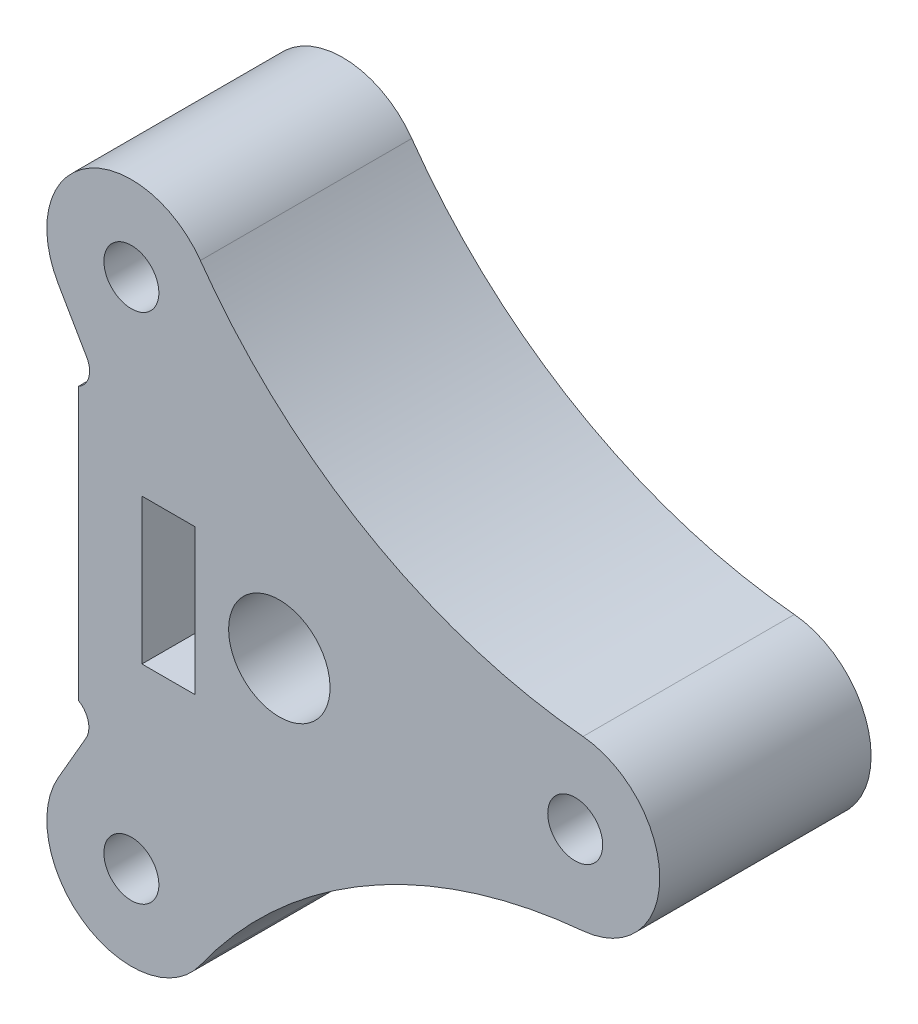
ISO-10303-21;
HEADER;
FILE_DESCRIPTION(('STEP AP214'),'2;1');
FILE_NAME('part.step','',(''),(''),'','','');
FILE_SCHEMA(('AUTOMOTIVE_DESIGN { 1 0 10303 214 1 1 1 1 }'));
ENDSEC;
DATA;
#1=APPLICATION_CONTEXT('core data for automotive mechanical design processes');
#2=APPLICATION_PROTOCOL_DEFINITION('international standard','automotive_design',2000,#1);
#3=PRODUCT_CONTEXT('',#1,'mechanical');
#4=PRODUCT('Part','Part','',(#3));
#5=PRODUCT_RELATED_PRODUCT_CATEGORY('part','',(#4));
#6=PRODUCT_DEFINITION_FORMATION('','',#4);
#7=PRODUCT_DEFINITION_CONTEXT('part definition',#1,'design');
#8=PRODUCT_DEFINITION('design','',#6,#7);
#9=PRODUCT_DEFINITION_SHAPE('','',#8);
#10=(LENGTH_UNIT() NAMED_UNIT(*) SI_UNIT(.MILLI.,.METRE.));
#11=(NAMED_UNIT(*) PLANE_ANGLE_UNIT() SI_UNIT($,.RADIAN.));
#12=(NAMED_UNIT(*) SI_UNIT($,.STERADIAN.) SOLID_ANGLE_UNIT());
#13=UNCERTAINTY_MEASURE_WITH_UNIT(LENGTH_MEASURE(1.E-05),#10,'distance_accuracy_value','');
#14=(GEOMETRIC_REPRESENTATION_CONTEXT(3) GLOBAL_UNCERTAINTY_ASSIGNED_CONTEXT((#13)) GLOBAL_UNIT_ASSIGNED_CONTEXT((#10,
#11,#12)) REPRESENTATION_CONTEXT('',''));
#15=CARTESIAN_POINT('',(0.,0.,0.));
#16=DIRECTION('',(0.,0.,1.));
#17=DIRECTION('',(1.,0.,0.));
#18=AXIS2_PLACEMENT_3D('',#15,#16,#17);
#19=CARTESIAN_POINT('',(-8.255,4.318,17.78));
#20=DIRECTION('',(1.,0.,0.));
#21=DIRECTION('',(0.,1.,0.));
#22=AXIS2_PLACEMENT_3D('',#19,#20,#21);
#23=PLANE('',#22);
#24=CARTESIAN_POINT('',(-8.255,-0.0507999999999993,8.89));
#25=DIRECTION('',(1.,0.,0.));
#26=DIRECTION('',(0.,1.,0.));
#27=AXIS2_PLACEMENT_3D('',#24,#25,#26);
#28=CIRCLE('',#27,2.159);
#29=CARTESIAN_POINT('',(-8.255,2.1082,8.89));
#30=VERTEX_POINT('',#29);
#31=EDGE_CURVE('E259',#30,#30,#28,.T.);
#32=ORIENTED_EDGE('',*,*,#31,.F.);
#33=EDGE_LOOP('',(#32));
#34=FACE_BOUND('',#33,.T.);
#35=DIRECTION('',(0.,0.,-1.));
#36=VECTOR('',#35,1.);
#37=CARTESIAN_POINT('',(-8.255,4.318,17.78));
#38=LINE('',#37,#36);
#39=CARTESIAN_POINT('',(-8.255,4.318,15.24));
#40=VERTEX_POINT('',#39);
#41=CARTESIAN_POINT('',(-8.255,4.318,3.937));
#42=VERTEX_POINT('',#41);
#43=EDGE_CURVE('E262',#40,#42,#38,.T.);
#44=ORIENTED_EDGE('',*,*,#43,.F.);
#45=DIRECTION('',(0.,-1.,0.));
#46=VECTOR('',#45,1.);
#47=CARTESIAN_POINT('',(-8.255,4.318,15.24));
#48=LINE('',#47,#46);
#49=CARTESIAN_POINT('',(-8.255,-4.4196,15.24));
#50=VERTEX_POINT('',#49);
#51=EDGE_CURVE('E55',#40,#50,#48,.T.);
#52=ORIENTED_EDGE('',*,*,#51,.T.);
#53=DIRECTION('',(0.,0.,-1.));
#54=VECTOR('',#53,1.);
#55=CARTESIAN_POINT('',(-8.255,-4.4196,17.78));
#56=LINE('',#55,#54);
#57=CARTESIAN_POINT('',(-8.255,-4.4196,3.937));
#58=VERTEX_POINT('',#57);
#59=EDGE_CURVE('E166',#50,#58,#56,.T.);
#60=ORIENTED_EDGE('',*,*,#59,.T.);
#61=DIRECTION('',(0.,-1.,0.));
#62=VECTOR('',#61,1.);
#63=CARTESIAN_POINT('',(-8.255,0.,3.937));
#64=LINE('',#63,#62);
#65=EDGE_CURVE('E265',#42,#58,#64,.T.);
#66=ORIENTED_EDGE('',*,*,#65,.F.);
#67=EDGE_LOOP('',(#44,#52,#60,#66));
#68=FACE_BOUND('',#67,.T.);
#69=ADVANCED_FACE('F40',(#34,#68),#23,.T.);
#70=CARTESIAN_POINT('',(-8.255,-4.4196,17.78));
#71=DIRECTION('',(0.,1.,0.));
#72=DIRECTION('',(0.,0.,1.));
#73=AXIS2_PLACEMENT_3D('',#70,#71,#72);
#74=PLANE('',#73);
#75=ORIENTED_EDGE('',*,*,#59,.F.);
#76=DIRECTION('',(1.,0.,0.));
#77=VECTOR('',#76,1.);
#78=CARTESIAN_POINT('',(-8.255,-4.4196,15.24));
#79=LINE('',#78,#77);
#80=CARTESIAN_POINT('',(-5.08,-4.4196,15.24));
#81=VERTEX_POINT('',#80);
#82=EDGE_CURVE('E300',#50,#81,#79,.T.);
#83=ORIENTED_EDGE('',*,*,#82,.T.);
#84=DIRECTION('',(0.,0.,-1.));
#85=VECTOR('',#84,1.);
#86=CARTESIAN_POINT('',(-5.08,-4.4196,17.78));
#87=LINE('',#86,#85);
#88=CARTESIAN_POINT('',(-5.08,-4.4196,3.937));
#89=VERTEX_POINT('',#88);
#90=EDGE_CURVE('E270',#81,#89,#87,.T.);
#91=ORIENTED_EDGE('',*,*,#90,.T.);
#92=DIRECTION('',(1.,0.,0.));
#93=VECTOR('',#92,1.);
#94=CARTESIAN_POINT('',(-17.8386121979137,-4.4196,3.937));
#95=LINE('',#94,#93);
#96=EDGE_CURVE('E272',#58,#89,#95,.T.);
#97=ORIENTED_EDGE('',*,*,#96,.F.);
#98=EDGE_LOOP('',(#75,#83,#91,#97));
#99=FACE_BOUND('',#98,.T.);
#100=ADVANCED_FACE('F248',(#99),#74,.T.);
#101=CARTESIAN_POINT('',(-5.08,4.318,17.78));
#102=DIRECTION('',(-1.,0.,0.));
#103=DIRECTION('',(0.,-1.,0.));
#104=AXIS2_PLACEMENT_3D('',#101,#102,#103);
#105=PLANE('',#104);
#106=CARTESIAN_POINT('',(-5.08,-0.050799999999999,8.89));
#107=DIRECTION('',(-1.,0.,0.));
#108=DIRECTION('',(0.,-1.,0.));
#109=AXIS2_PLACEMENT_3D('',#106,#107,#108);
#110=CIRCLE('',#109,2.159);
#111=CARTESIAN_POINT('',(-5.08,-2.2098,8.89));
#112=VERTEX_POINT('',#111);
#113=EDGE_CURVE('E189',#112,#112,#110,.T.);
#114=ORIENTED_EDGE('',*,*,#113,.F.);
#115=EDGE_LOOP('',(#114));
#116=FACE_BOUND('',#115,.T.);
#117=ORIENTED_EDGE('',*,*,#90,.F.);
#118=DIRECTION('',(0.,1.,0.));
#119=VECTOR('',#118,1.);
#120=CARTESIAN_POINT('',(-5.08,4.318,15.24));
#121=LINE('',#120,#119);
#122=CARTESIAN_POINT('',(-5.08,4.318,15.24));
#123=VERTEX_POINT('',#122);
#124=EDGE_CURVE('E302',#81,#123,#121,.T.);
#125=ORIENTED_EDGE('',*,*,#124,.T.);
#126=DIRECTION('',(0.,0.,-1.));
#127=VECTOR('',#126,1.);
#128=CARTESIAN_POINT('',(-5.08,4.318,17.78));
#129=LINE('',#128,#127);
#130=CARTESIAN_POINT('',(-5.08,4.318,3.937));
#131=VERTEX_POINT('',#130);
#132=EDGE_CURVE('E268',#123,#131,#129,.T.);
#133=ORIENTED_EDGE('',*,*,#132,.T.);
#134=DIRECTION('',(0.,1.,0.));
#135=VECTOR('',#134,1.);
#136=CARTESIAN_POINT('',(-5.08,0.,3.937));
#137=LINE('',#136,#135);
#138=EDGE_CURVE('E284',#89,#131,#137,.T.);
#139=ORIENTED_EDGE('',*,*,#138,.F.);
#140=EDGE_LOOP('',(#117,#125,#133,#139));
#141=FACE_BOUND('',#140,.T.);
#142=ADVANCED_FACE('F244',(#116,#141),#105,.T.);
#143=CARTESIAN_POINT('',(-8.255,4.318,17.78));
#144=DIRECTION('',(0.,-1.,0.));
#145=DIRECTION('',(0.,0.,-1.));
#146=AXIS2_PLACEMENT_3D('',#143,#144,#145);
#147=PLANE('',#146);
#148=ORIENTED_EDGE('',*,*,#132,.F.);
#149=DIRECTION('',(-1.,0.,0.));
#150=VECTOR('',#149,1.);
#151=CARTESIAN_POINT('',(-8.255,4.318,15.24));
#152=LINE('',#151,#150);
#153=EDGE_CURVE('E305',#123,#40,#152,.T.);
#154=ORIENTED_EDGE('',*,*,#153,.T.);
#155=ORIENTED_EDGE('',*,*,#43,.T.);
#156=DIRECTION('',(1.,0.,0.));
#157=VECTOR('',#156,1.);
#158=CARTESIAN_POINT('',(-17.8386121979137,4.318,3.937));
#159=LINE('',#158,#157);
#160=EDGE_CURVE('E282',#42,#131,#159,.T.);
#161=ORIENTED_EDGE('',*,*,#160,.T.);
#162=EDGE_LOOP('',(#148,#154,#155,#161));
#163=FACE_BOUND('',#162,.T.);
#164=ADVANCED_FACE('F241',(#163),#147,.T.);
#165=CARTESIAN_POINT('',(-12.065,8.128,17.78));
#166=DIRECTION('',(1.,0.,0.));
#167=DIRECTION('',(0.,1.,0.));
#168=AXIS2_PLACEMENT_3D('',#165,#166,#167);
#169=PLANE('',#168);
#170=CARTESIAN_POINT('',(-12.065,-0.0507999999999997,8.89));
#171=DIRECTION('',(-1.,0.,0.));
#172=DIRECTION('',(0.,-1.,0.));
#173=AXIS2_PLACEMENT_3D('',#170,#171,#172);
#174=CIRCLE('',#173,2.159);
#175=CARTESIAN_POINT('',(-12.065,-2.2098,8.89));
#176=VERTEX_POINT('',#175);
#177=EDGE_CURVE('E190',#176,#176,#174,.T.);
#178=ORIENTED_EDGE('',*,*,#177,.F.);
#179=EDGE_LOOP('',(#178));
#180=FACE_BOUND('',#179,.T.);
#181=DIRECTION('',(0.,-1.,0.));
#182=VECTOR('',#181,1.);
#183=CARTESIAN_POINT('',(-12.065,8.128,15.24));
#184=LINE('',#183,#182);
#185=CARTESIAN_POINT('',(-12.065,8.128,15.24));
#186=VERTEX_POINT('',#185);
#187=CARTESIAN_POINT('',(-12.065,-8.2296,15.24));
#188=VERTEX_POINT('',#187);
#189=EDGE_CURVE('E62',#186,#188,#184,.T.);
#190=ORIENTED_EDGE('',*,*,#189,.F.);
#191=DIRECTION('',(0.,0.,-1.));
#192=VECTOR('',#191,1.);
#193=CARTESIAN_POINT('',(-12.065,8.128,17.78));
#194=LINE('',#193,#192);
#195=CARTESIAN_POINT('',(-12.065,8.128,2.54));
#196=VERTEX_POINT('',#195);
#197=EDGE_CURVE('E158',#186,#196,#194,.T.);
#198=ORIENTED_EDGE('',*,*,#197,.T.);
#199=DIRECTION('',(0.,1.,0.));
#200=VECTOR('',#199,1.);
#201=CARTESIAN_POINT('',(-12.065,8.128,2.54));
#202=LINE('',#201,#200);
#203=CARTESIAN_POINT('',(-12.065,-8.2296,2.54));
#204=VERTEX_POINT('',#203);
#205=EDGE_CURVE('E143',#204,#196,#202,.T.);
#206=ORIENTED_EDGE('',*,*,#205,.F.);
#207=DIRECTION('',(0.,0.,-1.));
#208=VECTOR('',#207,1.);
#209=CARTESIAN_POINT('',(-12.065,-8.2296,17.78));
#210=LINE('',#209,#208);
#211=EDGE_CURVE('E156',#188,#204,#210,.T.);
#212=ORIENTED_EDGE('',*,*,#211,.F.);
#213=EDGE_LOOP('',(#190,#198,#206,#212));
#214=FACE_BOUND('',#213,.T.);
#215=ADVANCED_FACE('F155',(#180,#214),#169,.F.);
#216=CARTESIAN_POINT('',(0.,0.,17.78));
#217=DIRECTION('',(0.,0.,-1.));
#218=DIRECTION('',(-1.,0.,0.));
#219=AXIS2_PLACEMENT_3D('',#216,#217,#218);
#220=CYLINDRICAL_SURFACE('',#219,3.048);
#221=CARTESIAN_POINT('',(0.,0.,2.54));
#222=DIRECTION('',(0.,0.,-1.));
#223=DIRECTION('',(-1.,0.,0.));
#224=AXIS2_PLACEMENT_3D('',#221,#222,#223);
#225=CIRCLE('',#224,3.048);
#226=CARTESIAN_POINT('',(-3.048,0.,2.54));
#227=VERTEX_POINT('',#226);
#228=EDGE_CURVE('E340',#227,#227,#225,.T.);
#229=ORIENTED_EDGE('',*,*,#228,.T.);
#230=EDGE_LOOP('',(#229));
#231=FACE_BOUND('',#230,.T.);
#232=CARTESIAN_POINT('',(-3.048,0.,11.048402270199));
#233=CARTESIAN_POINT('',(-3.04800021273781,-0.106577269412155,11.0509110398938));
#234=CARTESIAN_POINT('',(-3.04236260226851,-0.213343628537018,11.0454801210088));
#235=CARTESIAN_POINT('',(-3.02024794855135,-0.423813591578894,11.0191788474239));
#236=CARTESIAN_POINT('',(-3.00376566677195,-0.527515689991738,10.9983010304742));
#237=CARTESIAN_POINT('',(-2.96144930679451,-0.728440689471085,10.9425384860442));
#238=CARTESIAN_POINT('',(-2.93566048557697,-0.825692294818296,10.9077214557374));
#239=CARTESIAN_POINT('',(-2.87663926148339,-1.01234678387282,10.8257457984958));
#240=CARTESIAN_POINT('',(-2.84340566097571,-1.10174840153858,10.7785851856598));
#241=CARTESIAN_POINT('',(-2.76852088546675,-1.27891525598773,10.6689845888528));
#242=CARTESIAN_POINT('',(-2.72639118900634,-1.3658759873865,10.6055783012993));
#243=CARTESIAN_POINT('',(-2.63862531140953,-1.5285693814744,10.4676175305917));
#244=CARTESIAN_POINT('',(-2.59298444409814,-1.60428662910432,10.3930480184445));
#245=CARTESIAN_POINT('',(-2.49252732591767,-1.75711606042688,10.2187744291384));
#246=CARTESIAN_POINT('',(-2.43760620681041,-1.83179075953557,10.1169832177788));
#247=CARTESIAN_POINT('',(-2.33304301324687,-1.96322202956935,9.89994012464014));
#248=CARTESIAN_POINT('',(-2.28339479244145,-2.01999961768119,9.78470425102162));
#249=CARTESIAN_POINT('',(-2.21089853553993,-2.09860661167048,9.57973954858017));
#250=CARTESIAN_POINT('',(-2.18452772578333,-2.12581211142243,9.49333498884068));
#251=CARTESIAN_POINT('',(-2.14125337939956,-2.16939845266315,9.31562300671316));
#252=CARTESIAN_POINT('',(-2.12432980139358,-2.18580222235605,9.22432641702486));
#253=CARTESIAN_POINT('',(-2.1025566088402,-2.20676509771804,9.03808807030396));
#254=CARTESIAN_POINT('',(-2.09780978480136,-2.21122337904388,8.94312210585857));
#255=CARTESIAN_POINT('',(-2.10164674329709,-2.20757519822925,8.75368867496069));
#256=CARTESIAN_POINT('',(-2.11023429105352,-2.19946518718577,8.65922135686914));
#257=CARTESIAN_POINT('',(-2.13754905517418,-2.17289834815849,8.48375962605255));
#258=CARTESIAN_POINT('',(-2.15511772441333,-2.15561654590928,8.40239163671532));
#259=CARTESIAN_POINT('',(-2.19740230193164,-2.11249608391381,8.24389917634703));
#260=CARTESIAN_POINT('',(-2.22212485617918,-2.08664946418517,8.16677873095455));
#261=CARTESIAN_POINT('',(-2.29166876705155,-2.01058970271065,7.97552990727033));
#262=CARTESIAN_POINT('',(-2.3399905183878,-1.95483798127348,7.86487468063018));
#263=CARTESIAN_POINT('',(-2.44139174449985,-1.82664318129362,7.65601071605306));
#264=CARTESIAN_POINT('',(-2.49448157841225,-1.75416319551203,7.55783025475732));
#265=CARTESIAN_POINT('',(-2.60109660412162,-1.59192455460207,7.37288407249533));
#266=CARTESIAN_POINT('',(-2.65460849510887,-1.50184284899251,7.28639285630157));
#267=CARTESIAN_POINT('',(-2.75608327821436,-1.30629365959937,7.12911843380243));
#268=CARTESIAN_POINT('',(-2.80405576605462,-1.20085351988641,7.05830786298539));
#269=CARTESIAN_POINT('',(-2.88201384013961,-0.99694682185346,6.9465577780827));
#270=CARTESIAN_POINT('',(-2.91368534513907,-0.900833628888969,6.90251172109537));
#271=CARTESIAN_POINT('',(-2.96811273918759,-0.700936432071112,6.82846199895927));
#272=CARTESIAN_POINT('',(-2.99087420292299,-0.59715727300814,6.79844955120147));
#273=CARTESIAN_POINT('',(-3.02566834189716,-0.383878932614965,6.7540551837105));
#274=CARTESIAN_POINT('',(-3.03763972614788,-0.274350768101231,6.73976245709791));
#275=CARTESIAN_POINT('',(-3.049524168564,-0.0537524641964189,6.72818231409059));
#276=CARTESIAN_POINT('',(-3.04944146323939,0.0573171197268999,6.73088892281809));
#277=CARTESIAN_POINT('',(-3.03795203970957,0.266655984828268,6.75212192156413));
#278=CARTESIAN_POINT('',(-3.02761333774637,0.365145061254613,6.76913326379597));
#279=CARTESIAN_POINT('',(-2.99814669828211,0.557585663579147,6.81612352974315));
#280=CARTESIAN_POINT('',(-2.97901701703621,0.651536285159086,6.84610502609919));
#281=CARTESIAN_POINT('',(-2.93259294780907,0.836448016472257,6.91912716228297));
#282=CARTESIAN_POINT('',(-2.90501154483605,0.927153197033646,6.96262779181894));
#283=CARTESIAN_POINT('',(-2.84400164757622,1.10017591301252,7.06067354455495));
#284=CARTESIAN_POINT('',(-2.81057197290178,1.18249174984626,7.11522089772465));
#285=CARTESIAN_POINT('',(-2.73438901170307,1.35025442758461,7.24343655436842));
#286=CARTESIAN_POINT('',(-2.69099709361064,1.43414176009387,7.3187641880663));
#287=CARTESIAN_POINT('',(-2.60256136188997,1.58901138845977,7.48112812137468));
#288=CARTESIAN_POINT('',(-2.55751418283018,1.65996541998659,7.56818935859553));
#289=CARTESIAN_POINT('',(-2.46297288313961,1.79778765698494,7.76713678592448));
#290=CARTESIAN_POINT('',(-2.41384465628133,1.86239255795627,7.88078471703387));
#291=CARTESIAN_POINT('',(-2.32607010939915,1.97093808254714,8.12116982284853));
#292=CARTESIAN_POINT('',(-2.2873889673371,2.01494772258304,8.24786151973184));
#293=CARTESIAN_POINT('',(-2.23926547719855,2.06804475277884,8.46608332872038));
#294=CARTESIAN_POINT('',(-2.22434371039064,2.08393508300328,8.55474342998348));
#295=CARTESIAN_POINT('',(-2.20492449018072,2.10447740451719,8.73442366615228));
#296=CARTESIAN_POINT('',(-2.20041100351077,2.1091466815658,8.82543995247977));
#297=CARTESIAN_POINT('',(-2.20253130819186,2.10693147188719,9.00727984213076));
#298=CARTESIAN_POINT('',(-2.20917590095076,2.10003578988679,9.09810317343396));
#299=CARTESIAN_POINT('',(-2.23254620516735,2.07516728183741,9.27694267260912));
#300=CARTESIAN_POINT('',(-2.24928748067729,2.05717735302283,9.36495428520888));
#301=CARTESIAN_POINT('',(-2.29653103642547,2.004450749326,9.56104447002157));
#302=CARTESIAN_POINT('',(-2.32960922307046,1.96638111251799,9.66759241170362));
#303=CARTESIAN_POINT('',(-2.40335489453037,1.87552813076624,9.87134447800864));
#304=CARTESIAN_POINT('',(-2.44403376966071,1.82272264343151,9.96853424291761));
#305=CARTESIAN_POINT('',(-2.52935612436719,1.70241732443861,10.1549432778197));
#306=CARTESIAN_POINT('',(-2.57406817223589,1.6346138430192,10.2439342500154));
#307=CARTESIAN_POINT('',(-2.66270652931498,1.48586796781687,10.41066360111));
#308=CARTESIAN_POINT('',(-2.70663253750124,1.40492065512671,10.4883977466045));
#309=CARTESIAN_POINT('',(-2.79706270568627,1.21630069309565,10.6429756829899));
#310=CARTESIAN_POINT('',(-2.84281930798702,1.1064224825296,10.7176074049798));
#311=CARTESIAN_POINT('',(-2.92330766366351,0.871706952707369,10.846550334433));
#312=CARTESIAN_POINT('',(-2.95805899908897,0.746896754088187,10.900897665742));
#313=CARTESIAN_POINT('',(-3.00529682612796,0.518271270483083,10.9752209707159));
#314=CARTESIAN_POINT('',(-3.02115446679048,0.416820992681504,11.0003589966624));
#315=CARTESIAN_POINT('',(-3.04250177388602,0.210306621220183,11.0357049249637));
#316=CARTESIAN_POINT('',(-3.0479997899205,0.105245507412861,11.0459248494415));
#317=CARTESIAN_POINT('',(-3.048,0.,11.048402270199));
#318=B_SPLINE_CURVE_WITH_KNOTS('',3,(#232,#233,#234,#235,#236,#237,#238,#239,#240,#241,#242,
#243,#244,#245,#246,#247,#248,#249,#250,#251,#252,#253,#254,#255,#256,#257,#258,#259,#260,#261,
#262,#263,#264,#265,#266,#267,#268,#269,#270,#271,#272,#273,#274,#275,#276,#277,#278,#279,#280,
#281,#282,#283,#284,#285,#286,#287,#288,#289,#290,#291,#292,#293,#294,#295,#296,#297,#298,#299,
#300,#301,#302,#303,#304,#305,#306,#307,#308,#309,#310,#311,#312,#313,#314,#315,#316,#317),
.UNSPECIFIED.,.T.,.F.,(4,2,2,2,2,2,2,2,2,2,2,2,2,2,2,2,2,2,2,2,2,2,2,2,2,2,2,2,2,2,2,2,2,2,2,2,
2,2,2,2,2,2,4),(0.,0.319394717847727,0.638943833080666,0.956959495417359,1.27502635329188,
1.62049482466578,1.96643265232159,2.37770737375764,2.78849730627415,3.07054778301312,
3.35199762101388,3.63581562506124,3.91971378527343,4.17382155634798,4.42816615594217,
4.82500873749127,5.2227353792286,5.62859589212083,6.03374245070736,6.36349853742687,
6.69304797682163,7.02445777258622,7.35575109190373,7.65582021011736,7.95594887459607,
8.26767865326562,8.57947142274918,8.94051756225248,9.30234350878481,9.71920840669919,
10.1346661718664,10.4074191855508,10.6797517597613,10.9523481133474,11.2253657525237,
11.5771004586455,11.9293665611117,12.2895517821207,12.6498721097388,13.0689469346724,
13.4872718402779,13.8029300060082,14.1183336500524),.UNSPECIFIED.);
#319=CARTESIAN_POINT('',(-3.048,0.,11.048402270199));
#320=VERTEX_POINT('',#319);
#321=EDGE_CURVE('E182',#320,#320,#318,.T.);
#322=ORIENTED_EDGE('',*,*,#321,.F.);
#323=EDGE_LOOP('',(#322));
#324=FACE_BOUND('',#323,.T.);
#325=CARTESIAN_POINT('',(0.,0.,15.24));
#326=DIRECTION('',(0.,0.,1.));
#327=DIRECTION('',(0.,-1.,0.));
#328=AXIS2_PLACEMENT_3D('',#325,#326,#327);
#329=CIRCLE('',#328,3.048);
#330=CARTESIAN_POINT('',(0.,-3.048,15.24));
#331=VERTEX_POINT('',#330);
#332=EDGE_CURVE('E307',#331,#331,#329,.T.);
#333=ORIENTED_EDGE('',*,*,#332,.T.);
#334=EDGE_LOOP('',(#333));
#335=FACE_BOUND('',#334,.T.);
#336=ADVANCED_FACE('F191',(#231,#324,#335),#220,.F.);
#337=CARTESIAN_POINT('',(-8.41753598467709,-4.4196,17.78));
#338=DIRECTION('',(-0.866025403784431,0.500000000000014,0.));
#339=DIRECTION('',(-0.500000000000014,-0.866025403784431,0.));
#340=AXIS2_PLACEMENT_3D('',#337,#338,#339);
#341=PLANE('',#340);
#342=DIRECTION('',(0.,0.,-1.));
#343=VECTOR('',#342,1.);
#344=CARTESIAN_POINT('',(-13.2894090512251,-12.8579316792872,17.78));
#345=LINE('',#344,#343);
#346=CARTESIAN_POINT('',(-13.2894090512251,-12.8579316792872,15.24));
#347=VERTEX_POINT('',#346);
#348=CARTESIAN_POINT('',(-13.2894090512251,-12.8579316792872,2.54));
#349=VERTEX_POINT('',#348);
#350=EDGE_CURVE('E289',#347,#349,#345,.T.);
#351=ORIENTED_EDGE('',*,*,#350,.F.);
#352=DIRECTION('',(0.500000000000014,0.866025403784431,0.));
#353=VECTOR('',#352,1.);
#354=CARTESIAN_POINT('',(-8.41753598467709,-4.4196,15.24));
#355=LINE('',#354,#353);
#356=CARTESIAN_POINT('',(-11.6141286968499,-9.95626098858751,15.24));
#357=VERTEX_POINT('',#356);
#358=EDGE_CURVE('E337',#347,#357,#355,.T.);
#359=ORIENTED_EDGE('',*,*,#358,.T.);
#360=DIRECTION('',(0.,0.,1.));
#361=VECTOR('',#360,1.);
#362=CARTESIAN_POINT('',(-11.6141286968499,-9.95626098858751,0.));
#363=LINE('',#362,#361);
#364=CARTESIAN_POINT('',(-11.6141286968499,-9.95626098858751,2.54));
#365=VERTEX_POINT('',#364);
#366=EDGE_CURVE('E151',#357,#365,#363,.F.);
#367=ORIENTED_EDGE('',*,*,#366,.T.);
#368=DIRECTION('',(-0.500000000000014,-0.866025403784431,0.));
#369=VECTOR('',#368,1.);
#370=CARTESIAN_POINT('',(-8.41753598467709,-4.4196,2.54));
#371=LINE('',#370,#369);
#372=EDGE_CURVE('E146',#365,#349,#371,.T.);
#373=ORIENTED_EDGE('',*,*,#372,.T.);
#374=EDGE_LOOP('',(#351,#359,#367,#373));
#375=FACE_BOUND('',#374,.T.);
#376=ADVANCED_FACE('F229',(#375),#341,.T.);
#377=CARTESIAN_POINT('',(-8.65217113407564,4.826,17.78));
#378=DIRECTION('',(-0.866025403784443,-0.499999999999992,0.));
#379=DIRECTION('',(0.499999999999992,-0.866025403784443,0.));
#380=AXIS2_PLACEMENT_3D('',#377,#378,#379);
#381=PLANE('',#380);
#382=DIRECTION('',(0.,0.,-1.));
#383=VECTOR('',#382,1.);
#384=CARTESIAN_POINT('',(-11.5699506347798,9.87974234050271,17.78));
#385=LINE('',#384,#383);
#386=CARTESIAN_POINT('',(-11.5699506347798,9.87974234050271,2.54));
#387=VERTEX_POINT('',#386);
#388=CARTESIAN_POINT('',(-11.5699506347798,9.87974234050271,15.24));
#389=VERTEX_POINT('',#388);
#390=EDGE_CURVE('E178',#387,#389,#385,.F.);
#391=ORIENTED_EDGE('',*,*,#390,.T.);
#392=DIRECTION('',(-0.499999999999992,0.866025403784443,0.));
#393=VECTOR('',#392,1.);
#394=CARTESIAN_POINT('',(-8.65217113407564,4.826,15.24));
#395=LINE('',#394,#393);
#396=CARTESIAN_POINT('',(-13.2894090512248,12.8579316792874,15.24));
#397=VERTEX_POINT('',#396);
#398=EDGE_CURVE('E330',#389,#397,#395,.T.);
#399=ORIENTED_EDGE('',*,*,#398,.T.);
#400=DIRECTION('',(0.,0.,-1.));
#401=VECTOR('',#400,1.);
#402=CARTESIAN_POINT('',(-13.2894090512248,12.8579316792874,17.78));
#403=LINE('',#402,#401);
#404=CARTESIAN_POINT('',(-13.2894090512248,12.8579316792874,2.54));
#405=VERTEX_POINT('',#404);
#406=EDGE_CURVE('E286',#397,#405,#403,.T.);
#407=ORIENTED_EDGE('',*,*,#406,.T.);
#408=DIRECTION('',(0.499999999999992,-0.866025403784443,0.));
#409=VECTOR('',#408,1.);
#410=CARTESIAN_POINT('',(-8.65217113407564,4.826,2.54));
#411=LINE('',#410,#409);
#412=EDGE_CURVE('E361',#405,#387,#411,.T.);
#413=ORIENTED_EDGE('',*,*,#412,.T.);
#414=EDGE_LOOP('',(#391,#399,#407,#413));
#415=FACE_BOUND('',#414,.T.);
#416=ADVANCED_FACE('F221',(#415),#381,.T.);
#417=CARTESIAN_POINT('',(17.78,-1.74339709335669E-13,17.78));
#418=DIRECTION('',(0.,0.,-1.));
#419=DIRECTION('',(-1.,0.,0.));
#420=AXIS2_PLACEMENT_3D('',#417,#418,#419);
#421=CYLINDRICAL_SURFACE('',#420,5.08);
#422=CARTESIAN_POINT('',(17.78,-1.74339709335669E-13,15.24));
#423=DIRECTION('',(0.,0.,1.));
#424=DIRECTION('',(0.,-1.,0.));
#425=AXIS2_PLACEMENT_3D('',#422,#423,#424);
#426=CIRCLE('',#425,5.08);
#427=CARTESIAN_POINT('',(18.2480501569443,5.05839194315572,15.24));
#428=VERTEX_POINT('',#427);
#429=CARTESIAN_POINT('',(18.2480501569442,-5.05839194315608,15.24));
#430=VERTEX_POINT('',#429);
#431=EDGE_CURVE('E319',#428,#430,#426,.F.);
#432=ORIENTED_EDGE('',*,*,#431,.T.);
#433=DIRECTION('',(0.,0.,-1.));
#434=VECTOR('',#433,1.);
#435=CARTESIAN_POINT('',(18.2480501569442,-5.05839194315607,17.78));
#436=LINE('',#435,#434);
#437=CARTESIAN_POINT('',(18.2480501569442,-5.05839194315608,2.54));
#438=VERTEX_POINT('',#437);
#439=EDGE_CURVE('E164',#430,#438,#436,.T.);
#440=ORIENTED_EDGE('',*,*,#439,.T.);
#441=CARTESIAN_POINT('',(17.78,-1.74339709335669E-13,2.54));
#442=DIRECTION('',(0.,0.,-1.));
#443=DIRECTION('',(-1.,0.,0.));
#444=AXIS2_PLACEMENT_3D('',#441,#442,#443);
#445=CIRCLE('',#444,5.08);
#446=CARTESIAN_POINT('',(18.2480501569443,5.05839194315572,2.54));
#447=VERTEX_POINT('',#446);
#448=EDGE_CURVE('E355',#438,#447,#445,.F.);
#449=ORIENTED_EDGE('',*,*,#448,.T.);
#450=DIRECTION('',(0.,0.,-1.));
#451=VECTOR('',#450,1.);
#452=CARTESIAN_POINT('',(18.2480501569443,5.05839194315572,17.78));
#453=LINE('',#452,#451);
#454=EDGE_CURVE('E161',#447,#428,#453,.F.);
#455=ORIENTED_EDGE('',*,*,#454,.T.);
#456=EDGE_LOOP('',(#432,#440,#449,#455));
#457=FACE_BOUND('',#456,.T.);
#458=ADVANCED_FACE('F217',(#457),#421,.T.);
#459=CARTESIAN_POINT('',(-8.88999999999985,15.3979316792874,17.78));
#460=DIRECTION('',(0.,0.,-1.));
#461=DIRECTION('',(-1.,0.,0.));
#462=AXIS2_PLACEMENT_3D('',#459,#460,#461);
#463=CYLINDRICAL_SURFACE('',#462,5.08);
#464=CARTESIAN_POINT('',(-8.88999999999985,15.3979316792874,15.24));
#465=DIRECTION('',(0.,0.,1.));
#466=DIRECTION('',(0.,-1.,0.));
#467=AXIS2_PLACEMENT_3D('',#464,#465,#466);
#468=CIRCLE('',#467,5.08);
#469=CARTESIAN_POINT('',(-4.74332915340041,18.3324709770243,15.24));
#470=VERTEX_POINT('',#469);
#471=EDGE_CURVE('E327',#397,#470,#468,.F.);
#472=ORIENTED_EDGE('',*,*,#471,.T.);
#473=DIRECTION('',(0.,0.,-1.));
#474=VECTOR('',#473,1.);
#475=CARTESIAN_POINT('',(-4.74332915340041,18.3324709770243,17.78));
#476=LINE('',#475,#474);
#477=CARTESIAN_POINT('',(-4.74332915340041,18.3324709770243,2.54));
#478=VERTEX_POINT('',#477);
#479=EDGE_CURVE('E175',#470,#478,#476,.T.);
#480=ORIENTED_EDGE('',*,*,#479,.T.);
#481=CARTESIAN_POINT('',(-8.88999999999985,15.3979316792874,2.54));
#482=DIRECTION('',(0.,0.,-1.));
#483=DIRECTION('',(-1.,0.,0.));
#484=AXIS2_PLACEMENT_3D('',#481,#482,#483);
#485=CIRCLE('',#484,5.08);
#486=EDGE_CURVE('E352',#478,#405,#485,.F.);
#487=ORIENTED_EDGE('',*,*,#486,.T.);
#488=ORIENTED_EDGE('',*,*,#406,.F.);
#489=EDGE_LOOP('',(#472,#480,#487,#488));
#490=FACE_BOUND('',#489,.T.);
#491=ADVANCED_FACE('F220',(#490),#463,.T.);
#492=CARTESIAN_POINT('',(-8.89000000000015,-15.3979316792872,17.78));
#493=DIRECTION('',(0.,0.,-1.));
#494=DIRECTION('',(-1.,0.,0.));
#495=AXIS2_PLACEMENT_3D('',#492,#493,#494);
#496=CYLINDRICAL_SURFACE('',#495,5.08);
#497=CARTESIAN_POINT('',(-8.89000000000015,-15.3979316792872,15.24));
#498=DIRECTION('',(0.,0.,1.));
#499=DIRECTION('',(0.,-1.,0.));
#500=AXIS2_PLACEMENT_3D('',#497,#498,#499);
#501=CIRCLE('',#500,5.08);
#502=CARTESIAN_POINT('',(-4.74332915340076,-18.3324709770242,15.24));
#503=VERTEX_POINT('',#502);
#504=EDGE_CURVE('E329',#503,#347,#501,.F.);
#505=ORIENTED_EDGE('',*,*,#504,.T.);
#506=ORIENTED_EDGE('',*,*,#350,.T.);
#507=CARTESIAN_POINT('',(-8.89000000000015,-15.3979316792872,2.54));
#508=DIRECTION('',(0.,0.,-1.));
#509=DIRECTION('',(-1.,0.,0.));
#510=AXIS2_PLACEMENT_3D('',#507,#508,#509);
#511=CIRCLE('',#510,5.08);
#512=CARTESIAN_POINT('',(-4.74332915340076,-18.3324709770242,2.54));
#513=VERTEX_POINT('',#512);
#514=EDGE_CURVE('E364',#349,#513,#511,.F.);
#515=ORIENTED_EDGE('',*,*,#514,.T.);
#516=DIRECTION('',(0.,0.,-1.));
#517=VECTOR('',#516,1.);
#518=CARTESIAN_POINT('',(-4.74332915340076,-18.3324709770242,17.78));
#519=LINE('',#518,#517);
#520=EDGE_CURVE('E172',#513,#503,#519,.F.);
#521=ORIENTED_EDGE('',*,*,#520,.T.);
#522=EDGE_LOOP('',(#505,#506,#515,#521));
#523=FACE_BOUND('',#522,.T.);
#524=ADVANCED_FACE('F225',(#523),#496,.T.);
#525=CARTESIAN_POINT('',(21.1733636378454,-36.6733415878805,17.78));
#526=DIRECTION('',(0.,0.,1.));
#527=DIRECTION('',(1.,0.,0.));
#528=AXIS2_PLACEMENT_3D('',#525,#526,#527);
#529=CYLINDRICAL_SURFACE('',#528,31.75);
#530=CARTESIAN_POINT('',(21.1733636378454,-36.6733415878805,15.24));
#531=DIRECTION('',(0.,0.,1.));
#532=DIRECTION('',(0.,-1.,0.));
#533=AXIS2_PLACEMENT_3D('',#530,#531,#532);
#534=CIRCLE('',#533,31.75);
#535=EDGE_CURVE('E321',#503,#430,#534,.F.);
#536=ORIENTED_EDGE('',*,*,#535,.F.);
#537=ORIENTED_EDGE('',*,*,#520,.F.);
#538=CARTESIAN_POINT('',(21.1733636378454,-36.6733415878805,2.54));
#539=DIRECTION('',(0.,0.,-1.));
#540=DIRECTION('',(-1.,0.,0.));
#541=AXIS2_PLACEMENT_3D('',#538,#539,#540);
#542=CIRCLE('',#541,31.75);
#543=EDGE_CURVE('E357',#438,#513,#542,.F.);
#544=ORIENTED_EDGE('',*,*,#543,.F.);
#545=ORIENTED_EDGE('',*,*,#439,.F.);
#546=EDGE_LOOP('',(#536,#537,#544,#545));
#547=FACE_BOUND('',#546,.T.);
#548=ADVANCED_FACE('F236',(#547),#529,.F.);
#549=CARTESIAN_POINT('',(21.1733636378461,36.67334158788,17.78));
#550=DIRECTION('',(0.,0.,1.));
#551=DIRECTION('',(1.,0.,0.));
#552=AXIS2_PLACEMENT_3D('',#549,#550,#551);
#553=CYLINDRICAL_SURFACE('',#552,31.75);
#554=CARTESIAN_POINT('',(21.1733636378461,36.67334158788,15.24));
#555=DIRECTION('',(0.,0.,1.));
#556=DIRECTION('',(0.,-1.,0.));
#557=AXIS2_PLACEMENT_3D('',#554,#555,#556);
#558=CIRCLE('',#557,31.75);
#559=EDGE_CURVE('E324',#428,#470,#558,.F.);
#560=ORIENTED_EDGE('',*,*,#559,.F.);
#561=ORIENTED_EDGE('',*,*,#454,.F.);
#562=CARTESIAN_POINT('',(21.1733636378461,36.67334158788,2.54));
#563=DIRECTION('',(0.,0.,-1.));
#564=DIRECTION('',(-1.,0.,0.));
#565=AXIS2_PLACEMENT_3D('',#562,#563,#564);
#566=CIRCLE('',#565,31.75);
#567=EDGE_CURVE('E353',#478,#447,#566,.F.);
#568=ORIENTED_EDGE('',*,*,#567,.F.);
#569=ORIENTED_EDGE('',*,*,#479,.F.);
#570=EDGE_LOOP('',(#560,#561,#568,#569));
#571=FACE_BOUND('',#570,.T.);
#572=ADVANCED_FACE('F405',(#571),#553,.F.);
#573=CARTESIAN_POINT('',(-12.6698028975861,9.24474234050272,17.78));
#574=DIRECTION('',(0.,0.,1.));
#575=DIRECTION('',(1.,0.,0.));
#576=AXIS2_PLACEMENT_3D('',#573,#574,#575);
#577=CYLINDRICAL_SURFACE('',#576,1.27);
#578=CARTESIAN_POINT('',(-12.6698028975861,9.24474234050272,15.24));
#579=DIRECTION('',(0.,0.,1.));
#580=DIRECTION('',(0.,-1.,0.));
#581=AXIS2_PLACEMENT_3D('',#578,#579,#580);
#582=CIRCLE('',#581,1.27);
#583=EDGE_CURVE('E333',#389,#186,#582,.F.);
#584=ORIENTED_EDGE('',*,*,#583,.F.);
#585=ORIENTED_EDGE('',*,*,#390,.F.);
#586=CARTESIAN_POINT('',(-12.6698028975861,9.24474234050272,2.54));
#587=DIRECTION('',(0.,0.,-1.));
#588=DIRECTION('',(-1.,0.,0.));
#589=AXIS2_PLACEMENT_3D('',#586,#587,#588);
#590=CIRCLE('',#589,1.27);
#591=EDGE_CURVE('E159',#196,#387,#590,.F.);
#592=ORIENTED_EDGE('',*,*,#591,.F.);
#593=ORIENTED_EDGE('',*,*,#197,.F.);
#594=EDGE_LOOP('',(#584,#585,#592,#593));
#595=FACE_BOUND('',#594,.T.);
#596=ADVANCED_FACE('F408',(#595),#577,.F.);
#597=CARTESIAN_POINT('',(-12.7139809596561,-9.32126098858749,17.78));
#598=DIRECTION('',(0.,0.,-1.));
#599=DIRECTION('',(-1.,0.,0.));
#600=AXIS2_PLACEMENT_3D('',#597,#598,#599);
#601=CYLINDRICAL_SURFACE('',#600,1.27);
#602=CARTESIAN_POINT('',(-12.7139809596561,-9.32126098858749,15.24));
#603=DIRECTION('',(0.,0.,1.));
#604=DIRECTION('',(0.,-1.,0.));
#605=AXIS2_PLACEMENT_3D('',#602,#603,#604);
#606=CIRCLE('',#605,1.27);
#607=EDGE_CURVE('E11',#188,#357,#606,.F.);
#608=ORIENTED_EDGE('',*,*,#607,.F.);
#609=ORIENTED_EDGE('',*,*,#211,.T.);
#610=CARTESIAN_POINT('',(-12.7139809596561,-9.32126098858749,2.54));
#611=DIRECTION('',(0.,0.,-1.));
#612=DIRECTION('',(-1.,0.,0.));
#613=AXIS2_PLACEMENT_3D('',#610,#611,#612);
#614=CIRCLE('',#613,1.27);
#615=EDGE_CURVE('E48',#365,#204,#614,.F.);
#616=ORIENTED_EDGE('',*,*,#615,.F.);
#617=ORIENTED_EDGE('',*,*,#366,.F.);
#618=EDGE_LOOP('',(#608,#609,#616,#617));
#619=FACE_BOUND('',#618,.T.);
#620=ADVANCED_FACE('F42',(#619),#601,.F.);
#621=CARTESIAN_POINT('',(-17.8386121979137,0.,3.937));
#622=DIRECTION('',(0.,0.,-1.));
#623=DIRECTION('',(-1.,0.,0.));
#624=AXIS2_PLACEMENT_3D('',#621,#622,#623);
#625=PLANE('',#624);
#626=ORIENTED_EDGE('',*,*,#160,.F.);
#627=ORIENTED_EDGE('',*,*,#65,.T.);
#628=ORIENTED_EDGE('',*,*,#96,.T.);
#629=ORIENTED_EDGE('',*,*,#138,.T.);
#630=EDGE_LOOP('',(#626,#627,#628,#629));
#631=FACE_BOUND('',#630,.T.);
#632=ADVANCED_FACE('F201',(#631),#625,.F.);
#633=CARTESIAN_POINT('',(0.635,-0.0507999999999984,8.89));
#634=DIRECTION('',(-1.,0.,0.));
#635=DIRECTION('',(0.,-1.,0.));
#636=AXIS2_PLACEMENT_3D('',#633,#634,#635);
#637=CYLINDRICAL_SURFACE('',#636,2.159);
#638=ORIENTED_EDGE('',*,*,#113,.T.);
#639=EDGE_LOOP('',(#638));
#640=FACE_BOUND('',#639,.T.);
#641=ORIENTED_EDGE('',*,*,#321,.T.);
#642=EDGE_LOOP('',(#641));
#643=FACE_BOUND('',#642,.T.);
#644=ADVANCED_FACE('F195',(#640,#643),#637,.F.);
#645=ORIENTED_EDGE('',*,*,#31,.T.);
#646=EDGE_LOOP('',(#645));
#647=FACE_BOUND('',#646,.T.);
#648=ORIENTED_EDGE('',*,*,#177,.T.);
#649=EDGE_LOOP('',(#648));
#650=FACE_BOUND('',#649,.T.);
#651=ADVANCED_FACE('F200',(#647,#650),#637,.F.);
#652=CARTESIAN_POINT('',(22.86,-25.4508,2.54));
#653=DIRECTION('',(0.,0.,-1.));
#654=DIRECTION('',(-1.,0.,0.));
#655=AXIS2_PLACEMENT_3D('',#652,#653,#654);
#656=PLANE('',#655);
#657=ORIENTED_EDGE('',*,*,#228,.F.);
#658=EDGE_LOOP('',(#657));
#659=FACE_BOUND('',#658,.T.);
#660=ORIENTED_EDGE('',*,*,#567,.T.);
#661=ORIENTED_EDGE('',*,*,#448,.F.);
#662=ORIENTED_EDGE('',*,*,#543,.T.);
#663=ORIENTED_EDGE('',*,*,#514,.F.);
#664=ORIENTED_EDGE('',*,*,#372,.F.);
#665=ORIENTED_EDGE('',*,*,#615,.T.);
#666=ORIENTED_EDGE('',*,*,#205,.T.);
#667=ORIENTED_EDGE('',*,*,#591,.T.);
#668=ORIENTED_EDGE('',*,*,#412,.F.);
#669=ORIENTED_EDGE('',*,*,#486,.F.);
#670=EDGE_LOOP('',(#660,#661,#662,#663,#664,#665,#666,#667,#668,#669));
#671=FACE_BOUND('',#670,.T.);
#672=CARTESIAN_POINT('',(17.78,-1.74339709335669E-13,2.54));
#673=DIRECTION('',(0.,0.,-1.));
#674=DIRECTION('',(-1.,0.,0.));
#675=AXIS2_PLACEMENT_3D('',#672,#673,#674);
#676=CIRCLE('',#675,1.651);
#677=CARTESIAN_POINT('',(16.129,-1.74339709335669E-13,2.54));
#678=VERTEX_POINT('',#677);
#679=EDGE_CURVE('E349',#678,#678,#676,.F.);
#680=ORIENTED_EDGE('',*,*,#679,.T.);
#681=EDGE_LOOP('',(#680));
#682=FACE_BOUND('',#681,.T.);
#683=CARTESIAN_POINT('',(-8.89000000000015,-15.3979316792872,2.54));
#684=DIRECTION('',(0.,0.,-1.));
#685=DIRECTION('',(-1.,0.,0.));
#686=AXIS2_PLACEMENT_3D('',#683,#684,#685);
#687=CIRCLE('',#686,1.65099999999999);
#688=CARTESIAN_POINT('',(-10.5410000000001,-15.3979316792872,2.54));
#689=VERTEX_POINT('',#688);
#690=EDGE_CURVE('E346',#689,#689,#687,.F.);
#691=ORIENTED_EDGE('',*,*,#690,.T.);
#692=EDGE_LOOP('',(#691));
#693=FACE_BOUND('',#692,.T.);
#694=CARTESIAN_POINT('',(-8.88999999999985,15.3979316792874,2.54));
#695=DIRECTION('',(0.,0.,-1.));
#696=DIRECTION('',(-1.,0.,0.));
#697=AXIS2_PLACEMENT_3D('',#694,#695,#696);
#698=CIRCLE('',#697,1.651);
#699=CARTESIAN_POINT('',(-10.5409999999999,15.3979316792874,2.54));
#700=VERTEX_POINT('',#699);
#701=EDGE_CURVE('E343',#700,#700,#698,.F.);
#702=ORIENTED_EDGE('',*,*,#701,.T.);
#703=EDGE_LOOP('',(#702));
#704=FACE_BOUND('',#703,.T.);
#705=ADVANCED_FACE('F141',(#659,#671,#682,#693,#704),#656,.T.);
#706=CARTESIAN_POINT('',(22.86,-25.4508,15.24));
#707=DIRECTION('',(0.,0.,1.));
#708=DIRECTION('',(0.,-1.,0.));
#709=AXIS2_PLACEMENT_3D('',#706,#707,#708);
#710=PLANE('',#709);
#711=ORIENTED_EDGE('',*,*,#153,.F.);
#712=ORIENTED_EDGE('',*,*,#124,.F.);
#713=ORIENTED_EDGE('',*,*,#82,.F.);
#714=ORIENTED_EDGE('',*,*,#51,.F.);
#715=EDGE_LOOP('',(#711,#712,#713,#714));
#716=FACE_BOUND('',#715,.T.);
#717=ORIENTED_EDGE('',*,*,#332,.F.);
#718=EDGE_LOOP('',(#717));
#719=FACE_BOUND('',#718,.T.);
#720=ORIENTED_EDGE('',*,*,#431,.F.);
#721=ORIENTED_EDGE('',*,*,#559,.T.);
#722=ORIENTED_EDGE('',*,*,#471,.F.);
#723=ORIENTED_EDGE('',*,*,#398,.F.);
#724=ORIENTED_EDGE('',*,*,#583,.T.);
#725=ORIENTED_EDGE('',*,*,#189,.T.);
#726=ORIENTED_EDGE('',*,*,#607,.T.);
#727=ORIENTED_EDGE('',*,*,#358,.F.);
#728=ORIENTED_EDGE('',*,*,#504,.F.);
#729=ORIENTED_EDGE('',*,*,#535,.T.);
#730=EDGE_LOOP('',(#720,#721,#722,#723,#724,#725,#726,#727,#728,#729));
#731=FACE_BOUND('',#730,.T.);
#732=CARTESIAN_POINT('',(17.78,-1.74339709335669E-13,15.24));
#733=DIRECTION('',(0.,0.,1.));
#734=DIRECTION('',(0.,-1.,0.));
#735=AXIS2_PLACEMENT_3D('',#732,#733,#734);
#736=CIRCLE('',#735,1.651);
#737=CARTESIAN_POINT('',(17.78,-1.65100000000017,15.24));
#738=VERTEX_POINT('',#737);
#739=EDGE_CURVE('E316',#738,#738,#736,.F.);
#740=ORIENTED_EDGE('',*,*,#739,.T.);
#741=EDGE_LOOP('',(#740));
#742=FACE_BOUND('',#741,.T.);
#743=CARTESIAN_POINT('',(-8.89000000000015,-15.3979316792872,15.24));
#744=DIRECTION('',(0.,0.,1.));
#745=DIRECTION('',(0.,-1.,0.));
#746=AXIS2_PLACEMENT_3D('',#743,#744,#745);
#747=CIRCLE('',#746,1.65099999999999);
#748=CARTESIAN_POINT('',(-8.89000000000015,-17.0489316792872,15.24));
#749=VERTEX_POINT('',#748);
#750=EDGE_CURVE('E313',#749,#749,#747,.F.);
#751=ORIENTED_EDGE('',*,*,#750,.T.);
#752=EDGE_LOOP('',(#751));
#753=FACE_BOUND('',#752,.T.);
#754=CARTESIAN_POINT('',(-8.88999999999985,15.3979316792874,15.24));
#755=DIRECTION('',(0.,0.,1.));
#756=DIRECTION('',(0.,-1.,0.));
#757=AXIS2_PLACEMENT_3D('',#754,#755,#756);
#758=CIRCLE('',#757,1.651);
#759=CARTESIAN_POINT('',(-8.88999999999985,13.7469316792874,15.24));
#760=VERTEX_POINT('',#759);
#761=EDGE_CURVE('E310',#760,#760,#758,.F.);
#762=ORIENTED_EDGE('',*,*,#761,.T.);
#763=EDGE_LOOP('',(#762));
#764=FACE_BOUND('',#763,.T.);
#765=ADVANCED_FACE('F203',(#716,#719,#731,#742,#753,#764),#710,.T.);
#766=CARTESIAN_POINT('',(17.78,-1.74339709335669E-13,17.78));
#767=DIRECTION('',(0.,0.,-1.));
#768=DIRECTION('',(-1.,0.,0.));
#769=AXIS2_PLACEMENT_3D('',#766,#767,#768);
#770=CYLINDRICAL_SURFACE('',#769,1.651);
#771=ORIENTED_EDGE('',*,*,#679,.F.);
#772=EDGE_LOOP('',(#771));
#773=FACE_BOUND('',#772,.T.);
#774=ORIENTED_EDGE('',*,*,#739,.F.);
#775=EDGE_LOOP('',(#774));
#776=FACE_BOUND('',#775,.T.);
#777=ADVANCED_FACE('F205',(#773,#776),#770,.F.);
#778=CARTESIAN_POINT('',(-8.89000000000015,-15.3979316792872,17.78));
#779=DIRECTION('',(0.,0.,-1.));
#780=DIRECTION('',(-1.,0.,0.));
#781=AXIS2_PLACEMENT_3D('',#778,#779,#780);
#782=CYLINDRICAL_SURFACE('',#781,1.65099999999999);
#783=ORIENTED_EDGE('',*,*,#690,.F.);
#784=EDGE_LOOP('',(#783));
#785=FACE_BOUND('',#784,.T.);
#786=ORIENTED_EDGE('',*,*,#750,.F.);
#787=EDGE_LOOP('',(#786));
#788=FACE_BOUND('',#787,.T.);
#789=ADVANCED_FACE('F208',(#785,#788),#782,.F.);
#790=CARTESIAN_POINT('',(-8.88999999999985,15.3979316792874,17.78));
#791=DIRECTION('',(0.,0.,-1.));
#792=DIRECTION('',(-1.,0.,0.));
#793=AXIS2_PLACEMENT_3D('',#790,#791,#792);
#794=CYLINDRICAL_SURFACE('',#793,1.651);
#795=ORIENTED_EDGE('',*,*,#701,.F.);
#796=EDGE_LOOP('',(#795));
#797=FACE_BOUND('',#796,.T.);
#798=ORIENTED_EDGE('',*,*,#761,.F.);
#799=EDGE_LOOP('',(#798));
#800=FACE_BOUND('',#799,.T.);
#801=ADVANCED_FACE('F212',(#797,#800),#794,.F.);
#802=CLOSED_SHELL('',(#69,#100,#142,#164,#215,#336,#376,#416,#458,#491,#524,#548,#572,#596,#620,
#632,#644,#651,#705,#765,#777,#789,#801));
#803=MANIFOLD_SOLID_BREP('B2',#802);
#804=ADVANCED_BREP_SHAPE_REPRESENTATION('',(#18,#803),#14);
#805=SHAPE_DEFINITION_REPRESENTATION(#9,#804);
ENDSEC;
END-ISO-10303-21;
